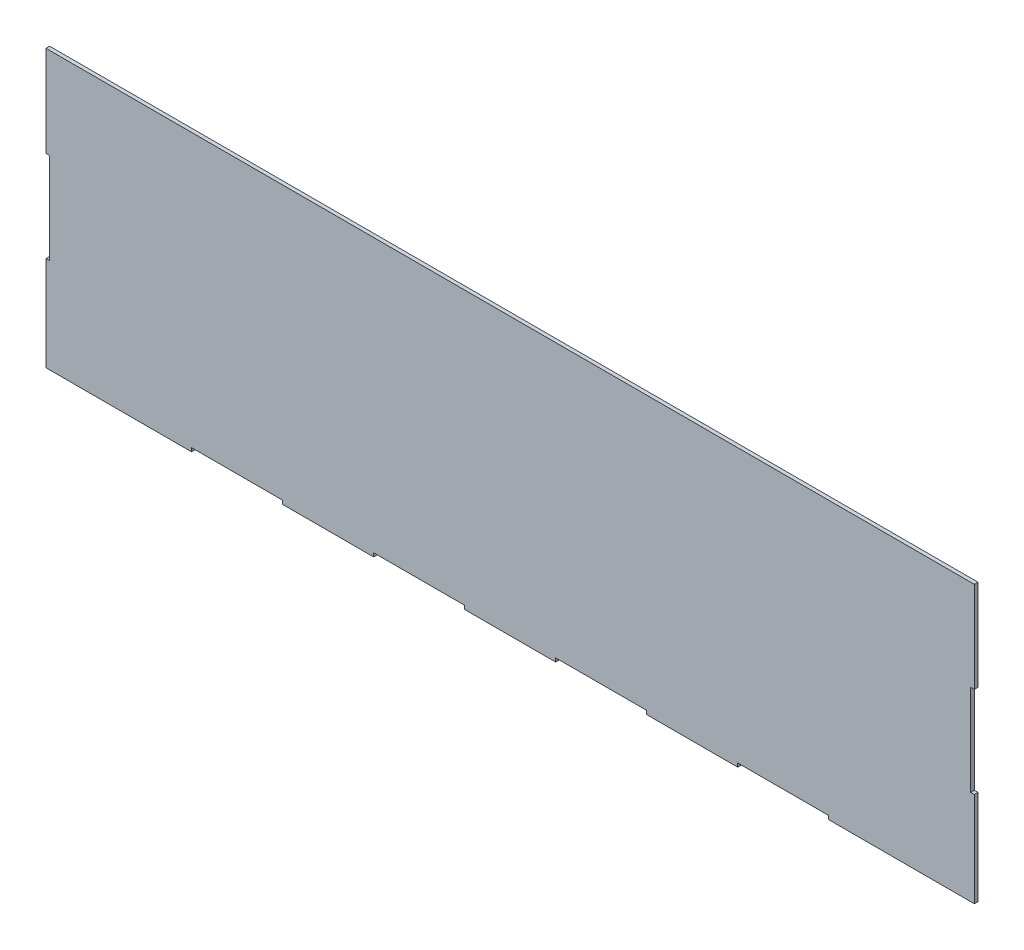
ISO-10303-21;
HEADER;
FILE_DESCRIPTION(('STEP AP214'),'2;1');
FILE_NAME('part.step','',(''),(''),'','','');
FILE_SCHEMA(('AUTOMOTIVE_DESIGN { 1 0 10303 214 1 1 1 1 }'));
ENDSEC;
DATA;
#1=APPLICATION_CONTEXT('core data for automotive mechanical design processes');
#2=APPLICATION_PROTOCOL_DEFINITION('international standard','automotive_design',2000,#1);
#3=PRODUCT_CONTEXT('',#1,'mechanical');
#4=PRODUCT('Part','Part','',(#3));
#5=PRODUCT_RELATED_PRODUCT_CATEGORY('part','',(#4));
#6=PRODUCT_DEFINITION_FORMATION('','',#4);
#7=PRODUCT_DEFINITION_CONTEXT('part definition',#1,'design');
#8=PRODUCT_DEFINITION('design','',#6,#7);
#9=PRODUCT_DEFINITION_SHAPE('','',#8);
#10=(LENGTH_UNIT() NAMED_UNIT(*) SI_UNIT(.MILLI.,.METRE.));
#11=(NAMED_UNIT(*) PLANE_ANGLE_UNIT() SI_UNIT($,.RADIAN.));
#12=(NAMED_UNIT(*) SI_UNIT($,.STERADIAN.) SOLID_ANGLE_UNIT());
#13=UNCERTAINTY_MEASURE_WITH_UNIT(LENGTH_MEASURE(1.E-05),#10,'distance_accuracy_value','');
#14=(GEOMETRIC_REPRESENTATION_CONTEXT(3) GLOBAL_UNCERTAINTY_ASSIGNED_CONTEXT((#13)) GLOBAL_UNIT_ASSIGNED_CONTEXT((#10,
#11,#12)) REPRESENTATION_CONTEXT('',''));
#15=CARTESIAN_POINT('',(0.,0.,0.));
#16=DIRECTION('',(0.,0.,1.));
#17=DIRECTION('',(1.,0.,0.));
#18=AXIS2_PLACEMENT_3D('',#15,#16,#17);
#19=CARTESIAN_POINT('',(878.999456567361,904.966316800808,4.));
#20=DIRECTION('',(1.,0.,0.));
#21=DIRECTION('',(0.,1.,0.));
#22=AXIS2_PLACEMENT_3D('',#19,#20,#21);
#23=PLANE('',#22);
#24=DIRECTION('',(0.,-1.,0.));
#25=VECTOR('',#24,1.);
#26=CARTESIAN_POINT('',(878.999456567361,904.966316800808,0.));
#27=LINE('',#26,#25);
#28=CARTESIAN_POINT('',(878.999456567361,904.966316800808,0.));
#29=VERTEX_POINT('',#28);
#30=CARTESIAN_POINT('',(878.999456567361,804.966316800808,0.));
#31=VERTEX_POINT('',#30);
#32=EDGE_CURVE('E251',#29,#31,#27,.T.);
#33=ORIENTED_EDGE('',*,*,#32,.T.);
#34=DIRECTION('',(0.,0.,-1.));
#35=VECTOR('',#34,1.);
#36=CARTESIAN_POINT('',(878.999456567361,804.966316800808,4.));
#37=LINE('',#36,#35);
#38=CARTESIAN_POINT('',(878.999456567361,804.966316800808,4.));
#39=VERTEX_POINT('',#38);
#40=EDGE_CURVE('E11',#39,#31,#37,.T.);
#41=ORIENTED_EDGE('',*,*,#40,.F.);
#42=DIRECTION('',(0.,-1.,0.));
#43=VECTOR('',#42,1.);
#44=CARTESIAN_POINT('',(878.999456567361,904.966316800808,4.));
#45=LINE('',#44,#43);
#46=CARTESIAN_POINT('',(878.999456567361,904.966316800808,4.));
#47=VERTEX_POINT('',#46);
#48=EDGE_CURVE('E305',#47,#39,#45,.T.);
#49=ORIENTED_EDGE('',*,*,#48,.F.);
#50=DIRECTION('',(0.,0.,-1.));
#51=VECTOR('',#50,1.);
#52=CARTESIAN_POINT('',(878.999456567361,904.966316800808,4.));
#53=LINE('',#52,#51);
#54=EDGE_CURVE('E247',#47,#29,#53,.T.);
#55=ORIENTED_EDGE('',*,*,#54,.T.);
#56=EDGE_LOOP('',(#33,#41,#49,#55));
#57=FACE_BOUND('',#56,.T.);
#58=ADVANCED_FACE('F35',(#57),#23,.F.);
#59=CARTESIAN_POINT('',(878.999456567361,804.966316800808,4.));
#60=DIRECTION('',(0.,-1.,0.));
#61=DIRECTION('',(0.,0.,-1.));
#62=AXIS2_PLACEMENT_3D('',#59,#60,#61);
#63=PLANE('',#62);
#64=DIRECTION('',(-1.,0.,0.));
#65=VECTOR('',#64,1.);
#66=CARTESIAN_POINT('',(878.999456567361,804.966316800808,0.));
#67=LINE('',#66,#65);
#68=CARTESIAN_POINT('',(874.999456567361,804.966316800808,0.));
#69=VERTEX_POINT('',#68);
#70=EDGE_CURVE('E254',#31,#69,#67,.T.);
#71=ORIENTED_EDGE('',*,*,#70,.T.);
#72=DIRECTION('',(0.,0.,-1.));
#73=VECTOR('',#72,1.);
#74=CARTESIAN_POINT('',(874.999456567361,804.966316800808,4.));
#75=LINE('',#74,#73);
#76=CARTESIAN_POINT('',(874.999456567361,804.966316800808,4.));
#77=VERTEX_POINT('',#76);
#78=EDGE_CURVE('E43',#77,#69,#75,.T.);
#79=ORIENTED_EDGE('',*,*,#78,.F.);
#80=DIRECTION('',(-1.,0.,0.));
#81=VECTOR('',#80,1.);
#82=CARTESIAN_POINT('',(878.999456567361,804.966316800808,4.));
#83=LINE('',#82,#81);
#84=EDGE_CURVE('E154',#39,#77,#83,.T.);
#85=ORIENTED_EDGE('',*,*,#84,.F.);
#86=ORIENTED_EDGE('',*,*,#40,.T.);
#87=EDGE_LOOP('',(#71,#79,#85,#86));
#88=FACE_BOUND('',#87,.T.);
#89=ADVANCED_FACE('F463',(#88),#63,.F.);
#90=CARTESIAN_POINT('',(874.999456567361,804.966316800808,4.));
#91=DIRECTION('',(1.,0.,0.));
#92=DIRECTION('',(0.,1.,0.));
#93=AXIS2_PLACEMENT_3D('',#90,#91,#92);
#94=PLANE('',#93);
#95=DIRECTION('',(0.,-1.,0.));
#96=VECTOR('',#95,1.);
#97=CARTESIAN_POINT('',(874.999456567361,804.966316800808,0.));
#98=LINE('',#97,#96);
#99=CARTESIAN_POINT('',(874.999456567361,700.966316800808,0.));
#100=VERTEX_POINT('',#99);
#101=EDGE_CURVE('E256',#69,#100,#98,.T.);
#102=ORIENTED_EDGE('',*,*,#101,.T.);
#103=DIRECTION('',(0.,0.,-1.));
#104=VECTOR('',#103,1.);
#105=CARTESIAN_POINT('',(874.999456567361,700.966316800808,4.));
#106=LINE('',#105,#104);
#107=CARTESIAN_POINT('',(874.999456567361,700.966316800808,4.));
#108=VERTEX_POINT('',#107);
#109=EDGE_CURVE('E372',#108,#100,#106,.T.);
#110=ORIENTED_EDGE('',*,*,#109,.F.);
#111=DIRECTION('',(0.,-1.,0.));
#112=VECTOR('',#111,1.);
#113=CARTESIAN_POINT('',(874.999456567361,804.966316800808,4.));
#114=LINE('',#113,#112);
#115=EDGE_CURVE('E380',#77,#108,#114,.T.);
#116=ORIENTED_EDGE('',*,*,#115,.F.);
#117=ORIENTED_EDGE('',*,*,#78,.T.);
#118=EDGE_LOOP('',(#102,#110,#116,#117));
#119=FACE_BOUND('',#118,.T.);
#120=ADVANCED_FACE('F378',(#119),#94,.F.);
#121=CARTESIAN_POINT('',(874.999456567361,700.966316800808,4.));
#122=DIRECTION('',(0.,1.,0.));
#123=DIRECTION('',(0.,0.,1.));
#124=AXIS2_PLACEMENT_3D('',#121,#122,#123);
#125=PLANE('',#124);
#126=DIRECTION('',(1.,0.,0.));
#127=VECTOR('',#126,1.);
#128=CARTESIAN_POINT('',(874.999456567361,700.966316800808,0.));
#129=LINE('',#128,#127);
#130=CARTESIAN_POINT('',(1034.99945656736,700.966316800808,0.));
#131=VERTEX_POINT('',#130);
#132=EDGE_CURVE('E258',#100,#131,#129,.T.);
#133=ORIENTED_EDGE('',*,*,#132,.T.);
#134=DIRECTION('',(0.,0.,-1.));
#135=VECTOR('',#134,1.);
#136=CARTESIAN_POINT('',(1034.99945656736,700.966316800808,4.));
#137=LINE('',#136,#135);
#138=CARTESIAN_POINT('',(1034.99945656736,700.966316800808,4.));
#139=VERTEX_POINT('',#138);
#140=EDGE_CURVE('E369',#139,#131,#137,.T.);
#141=ORIENTED_EDGE('',*,*,#140,.F.);
#142=DIRECTION('',(1.,0.,0.));
#143=VECTOR('',#142,1.);
#144=CARTESIAN_POINT('',(874.999456567361,700.966316800808,4.));
#145=LINE('',#144,#143);
#146=EDGE_CURVE('E398',#108,#139,#145,.T.);
#147=ORIENTED_EDGE('',*,*,#146,.F.);
#148=ORIENTED_EDGE('',*,*,#109,.T.);
#149=EDGE_LOOP('',(#133,#141,#147,#148));
#150=FACE_BOUND('',#149,.T.);
#151=ADVANCED_FACE('F389',(#150),#125,.F.);
#152=CARTESIAN_POINT('',(1034.99945656736,700.966316800808,4.));
#153=DIRECTION('',(-1.,0.,0.));
#154=DIRECTION('',(0.,0.,1.));
#155=AXIS2_PLACEMENT_3D('',#152,#153,#154);
#156=PLANE('',#155);
#157=DIRECTION('',(0.,1.,0.));
#158=VECTOR('',#157,1.);
#159=CARTESIAN_POINT('',(1034.99945656736,700.966316800808,0.));
#160=LINE('',#159,#158);
#161=CARTESIAN_POINT('',(1034.99945656736,704.966316800808,0.));
#162=VERTEX_POINT('',#161);
#163=EDGE_CURVE('E260',#131,#162,#160,.T.);
#164=ORIENTED_EDGE('',*,*,#163,.T.);
#165=DIRECTION('',(0.,0.,-1.));
#166=VECTOR('',#165,1.);
#167=CARTESIAN_POINT('',(1034.99945656736,704.966316800808,4.));
#168=LINE('',#167,#166);
#169=CARTESIAN_POINT('',(1034.99945656736,704.966316800808,4.));
#170=VERTEX_POINT('',#169);
#171=EDGE_CURVE('E366',#170,#162,#168,.T.);
#172=ORIENTED_EDGE('',*,*,#171,.F.);
#173=DIRECTION('',(0.,1.,0.));
#174=VECTOR('',#173,1.);
#175=CARTESIAN_POINT('',(1034.99945656736,700.966316800808,4.));
#176=LINE('',#175,#174);
#177=EDGE_CURVE('E395',#139,#170,#176,.T.);
#178=ORIENTED_EDGE('',*,*,#177,.F.);
#179=ORIENTED_EDGE('',*,*,#140,.T.);
#180=EDGE_LOOP('',(#164,#172,#178,#179));
#181=FACE_BOUND('',#180,.T.);
#182=ADVANCED_FACE('F393',(#181),#156,.F.);
#183=CARTESIAN_POINT('',(1034.99945656736,704.966316800808,4.));
#184=DIRECTION('',(0.,1.,0.));
#185=DIRECTION('',(0.,0.,1.));
#186=AXIS2_PLACEMENT_3D('',#183,#184,#185);
#187=PLANE('',#186);
#188=DIRECTION('',(1.,0.,0.));
#189=VECTOR('',#188,1.);
#190=CARTESIAN_POINT('',(1034.99945656736,704.966316800808,0.));
#191=LINE('',#190,#189);
#192=CARTESIAN_POINT('',(1134.99945656736,704.966316800808,0.));
#193=VERTEX_POINT('',#192);
#194=EDGE_CURVE('E262',#162,#193,#191,.T.);
#195=ORIENTED_EDGE('',*,*,#194,.T.);
#196=DIRECTION('',(0.,0.,-1.));
#197=VECTOR('',#196,1.);
#198=CARTESIAN_POINT('',(1134.99945656736,704.966316800808,4.));
#199=LINE('',#198,#197);
#200=CARTESIAN_POINT('',(1134.99945656736,704.966316800808,4.));
#201=VERTEX_POINT('',#200);
#202=EDGE_CURVE('E363',#201,#193,#199,.T.);
#203=ORIENTED_EDGE('',*,*,#202,.F.);
#204=DIRECTION('',(1.,0.,0.));
#205=VECTOR('',#204,1.);
#206=CARTESIAN_POINT('',(1034.99945656736,704.966316800808,4.));
#207=LINE('',#206,#205);
#208=EDGE_CURVE('E397',#170,#201,#207,.T.);
#209=ORIENTED_EDGE('',*,*,#208,.F.);
#210=ORIENTED_EDGE('',*,*,#171,.T.);
#211=EDGE_LOOP('',(#195,#203,#209,#210));
#212=FACE_BOUND('',#211,.T.);
#213=ADVANCED_FACE('F476',(#212),#187,.F.);
#214=CARTESIAN_POINT('',(1134.99945656736,704.966316800808,4.));
#215=DIRECTION('',(1.,0.,0.));
#216=DIRECTION('',(0.,0.,-1.));
#217=AXIS2_PLACEMENT_3D('',#214,#215,#216);
#218=PLANE('',#217);
#219=DIRECTION('',(0.,-1.,0.));
#220=VECTOR('',#219,1.);
#221=CARTESIAN_POINT('',(1134.99945656736,704.966316800808,0.));
#222=LINE('',#221,#220);
#223=CARTESIAN_POINT('',(1134.99945656736,700.966316800808,0.));
#224=VERTEX_POINT('',#223);
#225=EDGE_CURVE('E264',#193,#224,#222,.T.);
#226=ORIENTED_EDGE('',*,*,#225,.T.);
#227=DIRECTION('',(0.,0.,-1.));
#228=VECTOR('',#227,1.);
#229=CARTESIAN_POINT('',(1134.99945656736,700.966316800808,4.));
#230=LINE('',#229,#228);
#231=CARTESIAN_POINT('',(1134.99945656736,700.966316800808,4.));
#232=VERTEX_POINT('',#231);
#233=EDGE_CURVE('E360',#232,#224,#230,.T.);
#234=ORIENTED_EDGE('',*,*,#233,.F.);
#235=DIRECTION('',(0.,-1.,0.));
#236=VECTOR('',#235,1.);
#237=CARTESIAN_POINT('',(1134.99945656736,704.966316800808,4.));
#238=LINE('',#237,#236);
#239=EDGE_CURVE('E400',#201,#232,#238,.T.);
#240=ORIENTED_EDGE('',*,*,#239,.F.);
#241=ORIENTED_EDGE('',*,*,#202,.T.);
#242=EDGE_LOOP('',(#226,#234,#240,#241));
#243=FACE_BOUND('',#242,.T.);
#244=ADVANCED_FACE('F479',(#243),#218,.F.);
#245=CARTESIAN_POINT('',(1134.99945656736,700.966316800808,4.));
#246=DIRECTION('',(0.,1.,0.));
#247=DIRECTION('',(0.,0.,1.));
#248=AXIS2_PLACEMENT_3D('',#245,#246,#247);
#249=PLANE('',#248);
#250=DIRECTION('',(1.,0.,0.));
#251=VECTOR('',#250,1.);
#252=CARTESIAN_POINT('',(1134.99945656736,700.966316800808,0.));
#253=LINE('',#252,#251);
#254=CARTESIAN_POINT('',(1234.99945656736,700.966316800808,0.));
#255=VERTEX_POINT('',#254);
#256=EDGE_CURVE('E266',#224,#255,#253,.T.);
#257=ORIENTED_EDGE('',*,*,#256,.T.);
#258=DIRECTION('',(0.,0.,-1.));
#259=VECTOR('',#258,1.);
#260=CARTESIAN_POINT('',(1234.99945656736,700.966316800808,4.));
#261=LINE('',#260,#259);
#262=CARTESIAN_POINT('',(1234.99945656736,700.966316800808,4.));
#263=VERTEX_POINT('',#262);
#264=EDGE_CURVE('E357',#263,#255,#261,.T.);
#265=ORIENTED_EDGE('',*,*,#264,.F.);
#266=DIRECTION('',(1.,0.,0.));
#267=VECTOR('',#266,1.);
#268=CARTESIAN_POINT('',(1134.99945656736,700.966316800808,4.));
#269=LINE('',#268,#267);
#270=EDGE_CURVE('E406',#232,#263,#269,.T.);
#271=ORIENTED_EDGE('',*,*,#270,.F.);
#272=ORIENTED_EDGE('',*,*,#233,.T.);
#273=EDGE_LOOP('',(#257,#265,#271,#272));
#274=FACE_BOUND('',#273,.T.);
#275=ADVANCED_FACE('F483',(#274),#249,.F.);
#276=CARTESIAN_POINT('',(1234.99945656736,700.966316800808,4.));
#277=DIRECTION('',(-1.,0.,0.));
#278=DIRECTION('',(0.,0.,1.));
#279=AXIS2_PLACEMENT_3D('',#276,#277,#278);
#280=PLANE('',#279);
#281=DIRECTION('',(0.,1.,0.));
#282=VECTOR('',#281,1.);
#283=CARTESIAN_POINT('',(1234.99945656736,700.966316800808,0.));
#284=LINE('',#283,#282);
#285=CARTESIAN_POINT('',(1234.99945656736,704.966316800808,0.));
#286=VERTEX_POINT('',#285);
#287=EDGE_CURVE('E268',#255,#286,#284,.T.);
#288=ORIENTED_EDGE('',*,*,#287,.T.);
#289=DIRECTION('',(0.,0.,-1.));
#290=VECTOR('',#289,1.);
#291=CARTESIAN_POINT('',(1234.99945656736,704.966316800808,4.));
#292=LINE('',#291,#290);
#293=CARTESIAN_POINT('',(1234.99945656736,704.966316800808,4.));
#294=VERTEX_POINT('',#293);
#295=EDGE_CURVE('E354',#294,#286,#292,.T.);
#296=ORIENTED_EDGE('',*,*,#295,.F.);
#297=DIRECTION('',(0.,1.,0.));
#298=VECTOR('',#297,1.);
#299=CARTESIAN_POINT('',(1234.99945656736,700.966316800808,4.));
#300=LINE('',#299,#298);
#301=EDGE_CURVE('E408',#263,#294,#300,.T.);
#302=ORIENTED_EDGE('',*,*,#301,.F.);
#303=ORIENTED_EDGE('',*,*,#264,.T.);
#304=EDGE_LOOP('',(#288,#296,#302,#303));
#305=FACE_BOUND('',#304,.T.);
#306=ADVANCED_FACE('F487',(#305),#280,.F.);
#307=CARTESIAN_POINT('',(1234.99945656736,704.966316800808,4.));
#308=DIRECTION('',(0.,1.,0.));
#309=DIRECTION('',(0.,0.,1.));
#310=AXIS2_PLACEMENT_3D('',#307,#308,#309);
#311=PLANE('',#310);
#312=DIRECTION('',(1.,0.,0.));
#313=VECTOR('',#312,1.);
#314=CARTESIAN_POINT('',(1234.99945656736,704.966316800808,0.));
#315=LINE('',#314,#313);
#316=CARTESIAN_POINT('',(1334.99945656736,704.966316800808,0.));
#317=VERTEX_POINT('',#316);
#318=EDGE_CURVE('E270',#286,#317,#315,.T.);
#319=ORIENTED_EDGE('',*,*,#318,.T.);
#320=DIRECTION('',(0.,0.,-1.));
#321=VECTOR('',#320,1.);
#322=CARTESIAN_POINT('',(1334.99945656736,704.966316800808,4.));
#323=LINE('',#322,#321);
#324=CARTESIAN_POINT('',(1334.99945656736,704.966316800808,4.));
#325=VERTEX_POINT('',#324);
#326=EDGE_CURVE('E351',#325,#317,#323,.T.);
#327=ORIENTED_EDGE('',*,*,#326,.F.);
#328=DIRECTION('',(1.,0.,0.));
#329=VECTOR('',#328,1.);
#330=CARTESIAN_POINT('',(1234.99945656736,704.966316800808,4.));
#331=LINE('',#330,#329);
#332=EDGE_CURVE('E410',#294,#325,#331,.T.);
#333=ORIENTED_EDGE('',*,*,#332,.F.);
#334=ORIENTED_EDGE('',*,*,#295,.T.);
#335=EDGE_LOOP('',(#319,#327,#333,#334));
#336=FACE_BOUND('',#335,.T.);
#337=ADVANCED_FACE('F491',(#336),#311,.F.);
#338=CARTESIAN_POINT('',(1334.99945656736,704.966316800808,4.));
#339=DIRECTION('',(1.,0.,0.));
#340=DIRECTION('',(0.,0.,-1.));
#341=AXIS2_PLACEMENT_3D('',#338,#339,#340);
#342=PLANE('',#341);
#343=DIRECTION('',(0.,-1.,0.));
#344=VECTOR('',#343,1.);
#345=CARTESIAN_POINT('',(1334.99945656736,704.966316800808,0.));
#346=LINE('',#345,#344);
#347=CARTESIAN_POINT('',(1334.99945656736,700.966316800808,0.));
#348=VERTEX_POINT('',#347);
#349=EDGE_CURVE('E272',#317,#348,#346,.T.);
#350=ORIENTED_EDGE('',*,*,#349,.T.);
#351=DIRECTION('',(0.,0.,-1.));
#352=VECTOR('',#351,1.);
#353=CARTESIAN_POINT('',(1334.99945656736,700.966316800808,4.));
#354=LINE('',#353,#352);
#355=CARTESIAN_POINT('',(1334.99945656736,700.966316800808,4.));
#356=VERTEX_POINT('',#355);
#357=EDGE_CURVE('E348',#356,#348,#354,.T.);
#358=ORIENTED_EDGE('',*,*,#357,.F.);
#359=DIRECTION('',(0.,-1.,0.));
#360=VECTOR('',#359,1.);
#361=CARTESIAN_POINT('',(1334.99945656736,704.966316800808,4.));
#362=LINE('',#361,#360);
#363=EDGE_CURVE('E412',#325,#356,#362,.T.);
#364=ORIENTED_EDGE('',*,*,#363,.F.);
#365=ORIENTED_EDGE('',*,*,#326,.T.);
#366=EDGE_LOOP('',(#350,#358,#364,#365));
#367=FACE_BOUND('',#366,.T.);
#368=ADVANCED_FACE('F495',(#367),#342,.F.);
#369=CARTESIAN_POINT('',(1334.99945656736,700.966316800808,4.));
#370=DIRECTION('',(0.,1.,0.));
#371=DIRECTION('',(0.,0.,1.));
#372=AXIS2_PLACEMENT_3D('',#369,#370,#371);
#373=PLANE('',#372);
#374=DIRECTION('',(1.,0.,0.));
#375=VECTOR('',#374,1.);
#376=CARTESIAN_POINT('',(1334.99945656736,700.966316800808,0.));
#377=LINE('',#376,#375);
#378=CARTESIAN_POINT('',(1434.99945656736,700.966316800808,0.));
#379=VERTEX_POINT('',#378);
#380=EDGE_CURVE('E274',#348,#379,#377,.T.);
#381=ORIENTED_EDGE('',*,*,#380,.T.);
#382=DIRECTION('',(0.,0.,-1.));
#383=VECTOR('',#382,1.);
#384=CARTESIAN_POINT('',(1434.99945656736,700.966316800808,4.));
#385=LINE('',#384,#383);
#386=CARTESIAN_POINT('',(1434.99945656736,700.966316800808,4.));
#387=VERTEX_POINT('',#386);
#388=EDGE_CURVE('E345',#387,#379,#385,.T.);
#389=ORIENTED_EDGE('',*,*,#388,.F.);
#390=DIRECTION('',(1.,0.,0.));
#391=VECTOR('',#390,1.);
#392=CARTESIAN_POINT('',(1334.99945656736,700.966316800808,4.));
#393=LINE('',#392,#391);
#394=EDGE_CURVE('E414',#356,#387,#393,.T.);
#395=ORIENTED_EDGE('',*,*,#394,.F.);
#396=ORIENTED_EDGE('',*,*,#357,.T.);
#397=EDGE_LOOP('',(#381,#389,#395,#396));
#398=FACE_BOUND('',#397,.T.);
#399=ADVANCED_FACE('F499',(#398),#373,.F.);
#400=CARTESIAN_POINT('',(1434.99945656736,700.966316800808,4.));
#401=DIRECTION('',(-1.,0.,0.));
#402=DIRECTION('',(0.,0.,1.));
#403=AXIS2_PLACEMENT_3D('',#400,#401,#402);
#404=PLANE('',#403);
#405=DIRECTION('',(0.,1.,0.));
#406=VECTOR('',#405,1.);
#407=CARTESIAN_POINT('',(1434.99945656736,700.966316800808,0.));
#408=LINE('',#407,#406);
#409=CARTESIAN_POINT('',(1434.99945656736,704.966316800808,0.));
#410=VERTEX_POINT('',#409);
#411=EDGE_CURVE('E276',#379,#410,#408,.T.);
#412=ORIENTED_EDGE('',*,*,#411,.T.);
#413=DIRECTION('',(0.,0.,-1.));
#414=VECTOR('',#413,1.);
#415=CARTESIAN_POINT('',(1434.99945656736,704.966316800808,4.));
#416=LINE('',#415,#414);
#417=CARTESIAN_POINT('',(1434.99945656736,704.966316800808,4.));
#418=VERTEX_POINT('',#417);
#419=EDGE_CURVE('E342',#418,#410,#416,.T.);
#420=ORIENTED_EDGE('',*,*,#419,.F.);
#421=DIRECTION('',(0.,1.,0.));
#422=VECTOR('',#421,1.);
#423=CARTESIAN_POINT('',(1434.99945656736,700.966316800808,4.));
#424=LINE('',#423,#422);
#425=EDGE_CURVE('E416',#387,#418,#424,.T.);
#426=ORIENTED_EDGE('',*,*,#425,.F.);
#427=ORIENTED_EDGE('',*,*,#388,.T.);
#428=EDGE_LOOP('',(#412,#420,#426,#427));
#429=FACE_BOUND('',#428,.T.);
#430=ADVANCED_FACE('F503',(#429),#404,.F.);
#431=CARTESIAN_POINT('',(1434.99945656736,704.966316800808,4.));
#432=DIRECTION('',(0.,1.,0.));
#433=DIRECTION('',(0.,0.,1.));
#434=AXIS2_PLACEMENT_3D('',#431,#432,#433);
#435=PLANE('',#434);
#436=DIRECTION('',(1.,0.,0.));
#437=VECTOR('',#436,1.);
#438=CARTESIAN_POINT('',(1434.99945656736,704.966316800808,0.));
#439=LINE('',#438,#437);
#440=CARTESIAN_POINT('',(1534.99945656736,704.966316800808,0.));
#441=VERTEX_POINT('',#440);
#442=EDGE_CURVE('E278',#410,#441,#439,.T.);
#443=ORIENTED_EDGE('',*,*,#442,.T.);
#444=DIRECTION('',(0.,0.,-1.));
#445=VECTOR('',#444,1.);
#446=CARTESIAN_POINT('',(1534.99945656736,704.966316800808,4.));
#447=LINE('',#446,#445);
#448=CARTESIAN_POINT('',(1534.99945656736,704.966316800808,4.));
#449=VERTEX_POINT('',#448);
#450=EDGE_CURVE('E339',#449,#441,#447,.T.);
#451=ORIENTED_EDGE('',*,*,#450,.F.);
#452=DIRECTION('',(1.,0.,0.));
#453=VECTOR('',#452,1.);
#454=CARTESIAN_POINT('',(1434.99945656736,704.966316800808,4.));
#455=LINE('',#454,#453);
#456=EDGE_CURVE('E418',#418,#449,#455,.T.);
#457=ORIENTED_EDGE('',*,*,#456,.F.);
#458=ORIENTED_EDGE('',*,*,#419,.T.);
#459=EDGE_LOOP('',(#443,#451,#457,#458));
#460=FACE_BOUND('',#459,.T.);
#461=ADVANCED_FACE('F507',(#460),#435,.F.);
#462=CARTESIAN_POINT('',(1534.99945656736,704.966316800808,4.));
#463=DIRECTION('',(1.,0.,0.));
#464=DIRECTION('',(0.,0.,-1.));
#465=AXIS2_PLACEMENT_3D('',#462,#463,#464);
#466=PLANE('',#465);
#467=DIRECTION('',(0.,-1.,0.));
#468=VECTOR('',#467,1.);
#469=CARTESIAN_POINT('',(1534.99945656736,704.966316800808,0.));
#470=LINE('',#469,#468);
#471=CARTESIAN_POINT('',(1534.99945656736,700.966316800808,0.));
#472=VERTEX_POINT('',#471);
#473=EDGE_CURVE('E280',#441,#472,#470,.T.);
#474=ORIENTED_EDGE('',*,*,#473,.T.);
#475=DIRECTION('',(0.,0.,-1.));
#476=VECTOR('',#475,1.);
#477=CARTESIAN_POINT('',(1534.99945656736,700.966316800808,4.));
#478=LINE('',#477,#476);
#479=CARTESIAN_POINT('',(1534.99945656736,700.966316800808,4.));
#480=VERTEX_POINT('',#479);
#481=EDGE_CURVE('E336',#480,#472,#478,.T.);
#482=ORIENTED_EDGE('',*,*,#481,.F.);
#483=DIRECTION('',(0.,-1.,0.));
#484=VECTOR('',#483,1.);
#485=CARTESIAN_POINT('',(1534.99945656736,704.966316800808,4.));
#486=LINE('',#485,#484);
#487=EDGE_CURVE('E420',#449,#480,#486,.T.);
#488=ORIENTED_EDGE('',*,*,#487,.F.);
#489=ORIENTED_EDGE('',*,*,#450,.T.);
#490=EDGE_LOOP('',(#474,#482,#488,#489));
#491=FACE_BOUND('',#490,.T.);
#492=ADVANCED_FACE('F511',(#491),#466,.F.);
#493=CARTESIAN_POINT('',(1534.99945656736,700.966316800808,4.));
#494=DIRECTION('',(0.,1.,0.));
#495=DIRECTION('',(0.,0.,1.));
#496=AXIS2_PLACEMENT_3D('',#493,#494,#495);
#497=PLANE('',#496);
#498=DIRECTION('',(1.,0.,0.));
#499=VECTOR('',#498,1.);
#500=CARTESIAN_POINT('',(1534.99945656736,700.966316800808,0.));
#501=LINE('',#500,#499);
#502=CARTESIAN_POINT('',(1634.99945656736,700.966316800808,0.));
#503=VERTEX_POINT('',#502);
#504=EDGE_CURVE('E282',#472,#503,#501,.T.);
#505=ORIENTED_EDGE('',*,*,#504,.T.);
#506=DIRECTION('',(0.,0.,-1.));
#507=VECTOR('',#506,1.);
#508=CARTESIAN_POINT('',(1634.99945656736,700.966316800808,4.));
#509=LINE('',#508,#507);
#510=CARTESIAN_POINT('',(1634.99945656736,700.966316800808,4.));
#511=VERTEX_POINT('',#510);
#512=EDGE_CURVE('E333',#511,#503,#509,.T.);
#513=ORIENTED_EDGE('',*,*,#512,.F.);
#514=DIRECTION('',(1.,0.,0.));
#515=VECTOR('',#514,1.);
#516=CARTESIAN_POINT('',(1534.99945656736,700.966316800808,4.));
#517=LINE('',#516,#515);
#518=EDGE_CURVE('E422',#480,#511,#517,.T.);
#519=ORIENTED_EDGE('',*,*,#518,.F.);
#520=ORIENTED_EDGE('',*,*,#481,.T.);
#521=EDGE_LOOP('',(#505,#513,#519,#520));
#522=FACE_BOUND('',#521,.T.);
#523=ADVANCED_FACE('F515',(#522),#497,.F.);
#524=CARTESIAN_POINT('',(1634.99945656736,700.966316800808,4.));
#525=DIRECTION('',(-1.,0.,0.));
#526=DIRECTION('',(0.,0.,1.));
#527=AXIS2_PLACEMENT_3D('',#524,#525,#526);
#528=PLANE('',#527);
#529=DIRECTION('',(0.,1.,0.));
#530=VECTOR('',#529,1.);
#531=CARTESIAN_POINT('',(1634.99945656736,700.966316800808,0.));
#532=LINE('',#531,#530);
#533=CARTESIAN_POINT('',(1634.99945656736,704.966316800808,0.));
#534=VERTEX_POINT('',#533);
#535=EDGE_CURVE('E284',#503,#534,#532,.T.);
#536=ORIENTED_EDGE('',*,*,#535,.T.);
#537=DIRECTION('',(0.,0.,-1.));
#538=VECTOR('',#537,1.);
#539=CARTESIAN_POINT('',(1634.99945656736,704.966316800808,4.));
#540=LINE('',#539,#538);
#541=CARTESIAN_POINT('',(1634.99945656736,704.966316800808,4.));
#542=VERTEX_POINT('',#541);
#543=EDGE_CURVE('E330',#542,#534,#540,.T.);
#544=ORIENTED_EDGE('',*,*,#543,.F.);
#545=DIRECTION('',(0.,1.,0.));
#546=VECTOR('',#545,1.);
#547=CARTESIAN_POINT('',(1634.99945656736,700.966316800808,4.));
#548=LINE('',#547,#546);
#549=EDGE_CURVE('E424',#511,#542,#548,.T.);
#550=ORIENTED_EDGE('',*,*,#549,.F.);
#551=ORIENTED_EDGE('',*,*,#512,.T.);
#552=EDGE_LOOP('',(#536,#544,#550,#551));
#553=FACE_BOUND('',#552,.T.);
#554=ADVANCED_FACE('F519',(#553),#528,.F.);
#555=CARTESIAN_POINT('',(1634.99945656736,704.966316800808,4.));
#556=DIRECTION('',(0.,1.,0.));
#557=DIRECTION('',(0.,0.,1.));
#558=AXIS2_PLACEMENT_3D('',#555,#556,#557);
#559=PLANE('',#558);
#560=DIRECTION('',(1.,0.,0.));
#561=VECTOR('',#560,1.);
#562=CARTESIAN_POINT('',(1634.99945656736,704.966316800808,0.));
#563=LINE('',#562,#561);
#564=CARTESIAN_POINT('',(1734.99945656736,704.966316800808,0.));
#565=VERTEX_POINT('',#564);
#566=EDGE_CURVE('E286',#534,#565,#563,.T.);
#567=ORIENTED_EDGE('',*,*,#566,.T.);
#568=DIRECTION('',(0.,0.,-1.));
#569=VECTOR('',#568,1.);
#570=CARTESIAN_POINT('',(1734.99945656736,704.966316800808,4.));
#571=LINE('',#570,#569);
#572=CARTESIAN_POINT('',(1734.99945656736,704.966316800808,4.));
#573=VERTEX_POINT('',#572);
#574=EDGE_CURVE('E327',#573,#565,#571,.T.);
#575=ORIENTED_EDGE('',*,*,#574,.F.);
#576=DIRECTION('',(1.,0.,0.));
#577=VECTOR('',#576,1.);
#578=CARTESIAN_POINT('',(1634.99945656736,704.966316800808,4.));
#579=LINE('',#578,#577);
#580=EDGE_CURVE('E426',#542,#573,#579,.T.);
#581=ORIENTED_EDGE('',*,*,#580,.F.);
#582=ORIENTED_EDGE('',*,*,#543,.T.);
#583=EDGE_LOOP('',(#567,#575,#581,#582));
#584=FACE_BOUND('',#583,.T.);
#585=ADVANCED_FACE('F523',(#584),#559,.F.);
#586=CARTESIAN_POINT('',(1734.99945656736,704.966316800808,4.));
#587=DIRECTION('',(1.,0.,0.));
#588=DIRECTION('',(0.,0.,-1.));
#589=AXIS2_PLACEMENT_3D('',#586,#587,#588);
#590=PLANE('',#589);
#591=DIRECTION('',(0.,-1.,0.));
#592=VECTOR('',#591,1.);
#593=CARTESIAN_POINT('',(1734.99945656736,704.966316800808,0.));
#594=LINE('',#593,#592);
#595=CARTESIAN_POINT('',(1734.99945656736,700.966316800808,0.));
#596=VERTEX_POINT('',#595);
#597=EDGE_CURVE('E288',#565,#596,#594,.T.);
#598=ORIENTED_EDGE('',*,*,#597,.T.);
#599=DIRECTION('',(0.,0.,-1.));
#600=VECTOR('',#599,1.);
#601=CARTESIAN_POINT('',(1734.99945656736,700.966316800808,4.));
#602=LINE('',#601,#600);
#603=CARTESIAN_POINT('',(1734.99945656736,700.966316800808,4.));
#604=VERTEX_POINT('',#603);
#605=EDGE_CURVE('E324',#604,#596,#602,.T.);
#606=ORIENTED_EDGE('',*,*,#605,.F.);
#607=DIRECTION('',(0.,-1.,0.));
#608=VECTOR('',#607,1.);
#609=CARTESIAN_POINT('',(1734.99945656736,704.966316800808,4.));
#610=LINE('',#609,#608);
#611=EDGE_CURVE('E428',#573,#604,#610,.T.);
#612=ORIENTED_EDGE('',*,*,#611,.F.);
#613=ORIENTED_EDGE('',*,*,#574,.T.);
#614=EDGE_LOOP('',(#598,#606,#612,#613));
#615=FACE_BOUND('',#614,.T.);
#616=ADVANCED_FACE('F527',(#615),#590,.F.);
#617=CARTESIAN_POINT('',(1734.99945656736,700.966316800808,4.));
#618=DIRECTION('',(0.,1.,0.));
#619=DIRECTION('',(0.,0.,1.));
#620=AXIS2_PLACEMENT_3D('',#617,#618,#619);
#621=PLANE('',#620);
#622=DIRECTION('',(1.,0.,0.));
#623=VECTOR('',#622,1.);
#624=CARTESIAN_POINT('',(1734.99945656736,700.966316800808,0.));
#625=LINE('',#624,#623);
#626=CARTESIAN_POINT('',(1894.99945656736,700.966316800808,0.));
#627=VERTEX_POINT('',#626);
#628=EDGE_CURVE('E290',#596,#627,#625,.T.);
#629=ORIENTED_EDGE('',*,*,#628,.T.);
#630=DIRECTION('',(0.,0.,-1.));
#631=VECTOR('',#630,1.);
#632=CARTESIAN_POINT('',(1894.99945656736,700.966316800808,4.));
#633=LINE('',#632,#631);
#634=CARTESIAN_POINT('',(1894.99945656736,700.966316800808,4.));
#635=VERTEX_POINT('',#634);
#636=EDGE_CURVE('E321',#635,#627,#633,.T.);
#637=ORIENTED_EDGE('',*,*,#636,.F.);
#638=DIRECTION('',(1.,0.,0.));
#639=VECTOR('',#638,1.);
#640=CARTESIAN_POINT('',(1734.99945656736,700.966316800808,4.));
#641=LINE('',#640,#639);
#642=EDGE_CURVE('E430',#604,#635,#641,.T.);
#643=ORIENTED_EDGE('',*,*,#642,.F.);
#644=ORIENTED_EDGE('',*,*,#605,.T.);
#645=EDGE_LOOP('',(#629,#637,#643,#644));
#646=FACE_BOUND('',#645,.T.);
#647=ADVANCED_FACE('F531',(#646),#621,.F.);
#648=CARTESIAN_POINT('',(1894.99945656736,700.966316800808,4.));
#649=DIRECTION('',(-1.,0.,0.));
#650=DIRECTION('',(0.,-1.,0.));
#651=AXIS2_PLACEMENT_3D('',#648,#649,#650);
#652=PLANE('',#651);
#653=DIRECTION('',(0.,1.,0.));
#654=VECTOR('',#653,1.);
#655=CARTESIAN_POINT('',(1894.99945656736,700.966316800808,0.));
#656=LINE('',#655,#654);
#657=CARTESIAN_POINT('',(1894.99945656736,804.966316800808,0.));
#658=VERTEX_POINT('',#657);
#659=EDGE_CURVE('E292',#627,#658,#656,.T.);
#660=ORIENTED_EDGE('',*,*,#659,.T.);
#661=DIRECTION('',(0.,0.,-1.));
#662=VECTOR('',#661,1.);
#663=CARTESIAN_POINT('',(1894.99945656736,804.966316800808,4.));
#664=LINE('',#663,#662);
#665=CARTESIAN_POINT('',(1894.99945656736,804.966316800808,4.));
#666=VERTEX_POINT('',#665);
#667=EDGE_CURVE('E318',#666,#658,#664,.T.);
#668=ORIENTED_EDGE('',*,*,#667,.F.);
#669=DIRECTION('',(0.,1.,0.));
#670=VECTOR('',#669,1.);
#671=CARTESIAN_POINT('',(1894.99945656736,700.966316800808,4.));
#672=LINE('',#671,#670);
#673=EDGE_CURVE('E432',#635,#666,#672,.T.);
#674=ORIENTED_EDGE('',*,*,#673,.F.);
#675=ORIENTED_EDGE('',*,*,#636,.T.);
#676=EDGE_LOOP('',(#660,#668,#674,#675));
#677=FACE_BOUND('',#676,.T.);
#678=ADVANCED_FACE('F535',(#677),#652,.F.);
#679=CARTESIAN_POINT('',(1894.99945656736,804.966316800808,4.));
#680=DIRECTION('',(0.,-1.,0.));
#681=DIRECTION('',(0.,0.,-1.));
#682=AXIS2_PLACEMENT_3D('',#679,#680,#681);
#683=PLANE('',#682);
#684=DIRECTION('',(-1.,0.,0.));
#685=VECTOR('',#684,1.);
#686=CARTESIAN_POINT('',(1894.99945656736,804.966316800808,0.));
#687=LINE('',#686,#685);
#688=CARTESIAN_POINT('',(1890.99945656736,804.966316800808,0.));
#689=VERTEX_POINT('',#688);
#690=EDGE_CURVE('E294',#658,#689,#687,.T.);
#691=ORIENTED_EDGE('',*,*,#690,.T.);
#692=DIRECTION('',(0.,0.,-1.));
#693=VECTOR('',#692,1.);
#694=CARTESIAN_POINT('',(1890.99945656736,804.966316800808,4.));
#695=LINE('',#694,#693);
#696=CARTESIAN_POINT('',(1890.99945656736,804.966316800808,4.));
#697=VERTEX_POINT('',#696);
#698=EDGE_CURVE('E315',#697,#689,#695,.T.);
#699=ORIENTED_EDGE('',*,*,#698,.F.);
#700=DIRECTION('',(-1.,0.,0.));
#701=VECTOR('',#700,1.);
#702=CARTESIAN_POINT('',(1894.99945656736,804.966316800808,4.));
#703=LINE('',#702,#701);
#704=EDGE_CURVE('E434',#666,#697,#703,.T.);
#705=ORIENTED_EDGE('',*,*,#704,.F.);
#706=ORIENTED_EDGE('',*,*,#667,.T.);
#707=EDGE_LOOP('',(#691,#699,#705,#706));
#708=FACE_BOUND('',#707,.T.);
#709=ADVANCED_FACE('F539',(#708),#683,.F.);
#710=CARTESIAN_POINT('',(1890.99945656736,804.966316800808,4.));
#711=DIRECTION('',(-1.,0.,0.));
#712=DIRECTION('',(0.,-1.,0.));
#713=AXIS2_PLACEMENT_3D('',#710,#711,#712);
#714=PLANE('',#713);
#715=DIRECTION('',(0.,1.,0.));
#716=VECTOR('',#715,1.);
#717=CARTESIAN_POINT('',(1890.99945656736,804.966316800808,0.));
#718=LINE('',#717,#716);
#719=CARTESIAN_POINT('',(1890.99945656736,904.966316800808,0.));
#720=VERTEX_POINT('',#719);
#721=EDGE_CURVE('E296',#689,#720,#718,.T.);
#722=ORIENTED_EDGE('',*,*,#721,.T.);
#723=DIRECTION('',(0.,0.,-1.));
#724=VECTOR('',#723,1.);
#725=CARTESIAN_POINT('',(1890.99945656736,904.966316800808,4.));
#726=LINE('',#725,#724);
#727=CARTESIAN_POINT('',(1890.99945656736,904.966316800808,4.));
#728=VERTEX_POINT('',#727);
#729=EDGE_CURVE('E312',#728,#720,#726,.T.);
#730=ORIENTED_EDGE('',*,*,#729,.F.);
#731=DIRECTION('',(0.,1.,0.));
#732=VECTOR('',#731,1.);
#733=CARTESIAN_POINT('',(1890.99945656736,804.966316800808,4.));
#734=LINE('',#733,#732);
#735=EDGE_CURVE('E436',#697,#728,#734,.T.);
#736=ORIENTED_EDGE('',*,*,#735,.F.);
#737=ORIENTED_EDGE('',*,*,#698,.T.);
#738=EDGE_LOOP('',(#722,#730,#736,#737));
#739=FACE_BOUND('',#738,.T.);
#740=ADVANCED_FACE('F543',(#739),#714,.F.);
#741=CARTESIAN_POINT('',(1890.99945656736,904.966316800808,4.));
#742=DIRECTION('',(0.,1.,0.));
#743=DIRECTION('',(0.,0.,1.));
#744=AXIS2_PLACEMENT_3D('',#741,#742,#743);
#745=PLANE('',#744);
#746=DIRECTION('',(1.,0.,0.));
#747=VECTOR('',#746,1.);
#748=CARTESIAN_POINT('',(1890.99945656736,904.966316800808,0.));
#749=LINE('',#748,#747);
#750=CARTESIAN_POINT('',(1894.99945656736,904.966316800808,0.));
#751=VERTEX_POINT('',#750);
#752=EDGE_CURVE('E298',#720,#751,#749,.T.);
#753=ORIENTED_EDGE('',*,*,#752,.T.);
#754=DIRECTION('',(0.,0.,-1.));
#755=VECTOR('',#754,1.);
#756=CARTESIAN_POINT('',(1894.99945656736,904.966316800808,4.));
#757=LINE('',#756,#755);
#758=CARTESIAN_POINT('',(1894.99945656736,904.966316800808,4.));
#759=VERTEX_POINT('',#758);
#760=EDGE_CURVE('E309',#759,#751,#757,.T.);
#761=ORIENTED_EDGE('',*,*,#760,.F.);
#762=DIRECTION('',(1.,0.,0.));
#763=VECTOR('',#762,1.);
#764=CARTESIAN_POINT('',(1890.99945656736,904.966316800808,4.));
#765=LINE('',#764,#763);
#766=EDGE_CURVE('E438',#728,#759,#765,.T.);
#767=ORIENTED_EDGE('',*,*,#766,.F.);
#768=ORIENTED_EDGE('',*,*,#729,.T.);
#769=EDGE_LOOP('',(#753,#761,#767,#768));
#770=FACE_BOUND('',#769,.T.);
#771=ADVANCED_FACE('F444',(#770),#745,.F.);
#772=CARTESIAN_POINT('',(1894.99945656736,904.966316800808,4.));
#773=DIRECTION('',(-1.,0.,0.));
#774=DIRECTION('',(0.,0.,1.));
#775=AXIS2_PLACEMENT_3D('',#772,#773,#774);
#776=PLANE('',#775);
#777=DIRECTION('',(0.,1.,0.));
#778=VECTOR('',#777,1.);
#779=CARTESIAN_POINT('',(1894.99945656736,904.966316800808,0.));
#780=LINE('',#779,#778);
#781=CARTESIAN_POINT('',(1894.99945656736,1004.96631680081,0.));
#782=VERTEX_POINT('',#781);
#783=EDGE_CURVE('E300',#751,#782,#780,.T.);
#784=ORIENTED_EDGE('',*,*,#783,.T.);
#785=DIRECTION('',(0.,0.,-1.));
#786=VECTOR('',#785,1.);
#787=CARTESIAN_POINT('',(1894.99945656736,1004.96631680081,4.));
#788=LINE('',#787,#786);
#789=CARTESIAN_POINT('',(1894.99945656736,1004.96631680081,4.));
#790=VERTEX_POINT('',#789);
#791=EDGE_CURVE('E242',#790,#782,#788,.T.);
#792=ORIENTED_EDGE('',*,*,#791,.F.);
#793=DIRECTION('',(0.,1.,0.));
#794=VECTOR('',#793,1.);
#795=CARTESIAN_POINT('',(1894.99945656736,904.966316800808,4.));
#796=LINE('',#795,#794);
#797=EDGE_CURVE('E233',#759,#790,#796,.T.);
#798=ORIENTED_EDGE('',*,*,#797,.F.);
#799=ORIENTED_EDGE('',*,*,#760,.T.);
#800=EDGE_LOOP('',(#784,#792,#798,#799));
#801=FACE_BOUND('',#800,.T.);
#802=ADVANCED_FACE('F448',(#801),#776,.F.);
#803=CARTESIAN_POINT('',(874.999456567361,1004.96631680081,4.));
#804=DIRECTION('',(0.,-1.,0.));
#805=DIRECTION('',(0.,0.,-1.));
#806=AXIS2_PLACEMENT_3D('',#803,#804,#805);
#807=PLANE('',#806);
#808=DIRECTION('',(-1.,0.,0.));
#809=VECTOR('',#808,1.);
#810=CARTESIAN_POINT('',(874.999456567361,1004.96631680081,0.));
#811=LINE('',#810,#809);
#812=CARTESIAN_POINT('',(874.999456567361,1004.96631680081,0.));
#813=VERTEX_POINT('',#812);
#814=EDGE_CURVE('E241',#782,#813,#811,.T.);
#815=ORIENTED_EDGE('',*,*,#814,.T.);
#816=DIRECTION('',(0.,0.,-1.));
#817=VECTOR('',#816,1.);
#818=CARTESIAN_POINT('',(874.999456567361,1004.96631680081,4.));
#819=LINE('',#818,#817);
#820=CARTESIAN_POINT('',(874.999456567361,1004.96631680081,4.));
#821=VERTEX_POINT('',#820);
#822=EDGE_CURVE('E238',#821,#813,#819,.T.);
#823=ORIENTED_EDGE('',*,*,#822,.F.);
#824=DIRECTION('',(-1.,0.,0.));
#825=VECTOR('',#824,1.);
#826=CARTESIAN_POINT('',(874.999456567361,1004.96631680081,4.));
#827=LINE('',#826,#825);
#828=EDGE_CURVE('E227',#790,#821,#827,.T.);
#829=ORIENTED_EDGE('',*,*,#828,.F.);
#830=ORIENTED_EDGE('',*,*,#791,.T.);
#831=EDGE_LOOP('',(#815,#823,#829,#830));
#832=FACE_BOUND('',#831,.T.);
#833=ADVANCED_FACE('F239',(#832),#807,.F.);
#834=CARTESIAN_POINT('',(874.999456567361,1004.96631680081,4.));
#835=DIRECTION('',(1.,0.,0.));
#836=DIRECTION('',(0.,0.,-1.));
#837=AXIS2_PLACEMENT_3D('',#834,#835,#836);
#838=PLANE('',#837);
#839=DIRECTION('',(0.,-1.,0.));
#840=VECTOR('',#839,1.);
#841=CARTESIAN_POINT('',(874.999456567361,1004.96631680081,0.));
#842=LINE('',#841,#840);
#843=CARTESIAN_POINT('',(874.999456567361,904.966316800808,0.));
#844=VERTEX_POINT('',#843);
#845=EDGE_CURVE('E140',#813,#844,#842,.T.);
#846=ORIENTED_EDGE('',*,*,#845,.T.);
#847=DIRECTION('',(0.,0.,-1.));
#848=VECTOR('',#847,1.);
#849=CARTESIAN_POINT('',(874.999456567361,904.966316800808,4.));
#850=LINE('',#849,#848);
#851=CARTESIAN_POINT('',(874.999456567361,904.966316800808,4.));
#852=VERTEX_POINT('',#851);
#853=EDGE_CURVE('E243',#852,#844,#850,.T.);
#854=ORIENTED_EDGE('',*,*,#853,.F.);
#855=DIRECTION('',(0.,-1.,0.));
#856=VECTOR('',#855,1.);
#857=CARTESIAN_POINT('',(874.999456567361,1004.96631680081,4.));
#858=LINE('',#857,#856);
#859=EDGE_CURVE('E231',#821,#852,#858,.T.);
#860=ORIENTED_EDGE('',*,*,#859,.F.);
#861=ORIENTED_EDGE('',*,*,#822,.T.);
#862=EDGE_LOOP('',(#846,#854,#860,#861));
#863=FACE_BOUND('',#862,.T.);
#864=ADVANCED_FACE('F245',(#863),#838,.F.);
#865=CARTESIAN_POINT('',(874.999456567361,904.966316800808,4.));
#866=DIRECTION('',(0.,1.,0.));
#867=DIRECTION('',(0.,0.,1.));
#868=AXIS2_PLACEMENT_3D('',#865,#866,#867);
#869=PLANE('',#868);
#870=DIRECTION('',(1.,0.,0.));
#871=VECTOR('',#870,1.);
#872=CARTESIAN_POINT('',(874.999456567361,904.966316800808,0.));
#873=LINE('',#872,#871);
#874=EDGE_CURVE('E146',#844,#29,#873,.T.);
#875=ORIENTED_EDGE('',*,*,#874,.T.);
#876=ORIENTED_EDGE('',*,*,#54,.F.);
#877=DIRECTION('',(1.,0.,0.));
#878=VECTOR('',#877,1.);
#879=CARTESIAN_POINT('',(874.999456567361,904.966316800808,4.));
#880=LINE('',#879,#878);
#881=EDGE_CURVE('E51',#852,#47,#880,.T.);
#882=ORIENTED_EDGE('',*,*,#881,.F.);
#883=ORIENTED_EDGE('',*,*,#853,.T.);
#884=EDGE_LOOP('',(#875,#876,#882,#883));
#885=FACE_BOUND('',#884,.T.);
#886=ADVANCED_FACE('F452',(#885),#869,.F.);
#887=CARTESIAN_POINT('',(0.,0.,4.));
#888=DIRECTION('',(0.,0.,-1.));
#889=DIRECTION('',(-1.,0.,0.));
#890=AXIS2_PLACEMENT_3D('',#887,#888,#889);
#891=PLANE('',#890);
#892=ORIENTED_EDGE('',*,*,#48,.T.);
#893=ORIENTED_EDGE('',*,*,#84,.T.);
#894=ORIENTED_EDGE('',*,*,#115,.T.);
#895=ORIENTED_EDGE('',*,*,#146,.T.);
#896=ORIENTED_EDGE('',*,*,#177,.T.);
#897=ORIENTED_EDGE('',*,*,#208,.T.);
#898=ORIENTED_EDGE('',*,*,#239,.T.);
#899=ORIENTED_EDGE('',*,*,#270,.T.);
#900=ORIENTED_EDGE('',*,*,#301,.T.);
#901=ORIENTED_EDGE('',*,*,#332,.T.);
#902=ORIENTED_EDGE('',*,*,#363,.T.);
#903=ORIENTED_EDGE('',*,*,#394,.T.);
#904=ORIENTED_EDGE('',*,*,#425,.T.);
#905=ORIENTED_EDGE('',*,*,#456,.T.);
#906=ORIENTED_EDGE('',*,*,#487,.T.);
#907=ORIENTED_EDGE('',*,*,#518,.T.);
#908=ORIENTED_EDGE('',*,*,#549,.T.);
#909=ORIENTED_EDGE('',*,*,#580,.T.);
#910=ORIENTED_EDGE('',*,*,#611,.T.);
#911=ORIENTED_EDGE('',*,*,#642,.T.);
#912=ORIENTED_EDGE('',*,*,#673,.T.);
#913=ORIENTED_EDGE('',*,*,#704,.T.);
#914=ORIENTED_EDGE('',*,*,#735,.T.);
#915=ORIENTED_EDGE('',*,*,#766,.T.);
#916=ORIENTED_EDGE('',*,*,#797,.T.);
#917=ORIENTED_EDGE('',*,*,#828,.T.);
#918=ORIENTED_EDGE('',*,*,#859,.T.);
#919=ORIENTED_EDGE('',*,*,#881,.T.);
#920=EDGE_LOOP('',(#892,#893,#894,#895,#896,#897,#898,#899,#900,#901,#902,#903,#904,#905,#906,
#907,#908,#909,#910,#911,#912,#913,#914,#915,#916,#917,#918,#919));
#921=FACE_BOUND('',#920,.T.);
#922=ADVANCED_FACE('F229',(#921),#891,.F.);
#923=CARTESIAN_POINT('',(0.,0.,0.));
#924=DIRECTION('',(0.,0.,-1.));
#925=DIRECTION('',(-1.,0.,0.));
#926=AXIS2_PLACEMENT_3D('',#923,#924,#925);
#927=PLANE('',#926);
#928=ORIENTED_EDGE('',*,*,#32,.F.);
#929=ORIENTED_EDGE('',*,*,#874,.F.);
#930=ORIENTED_EDGE('',*,*,#845,.F.);
#931=ORIENTED_EDGE('',*,*,#814,.F.);
#932=ORIENTED_EDGE('',*,*,#783,.F.);
#933=ORIENTED_EDGE('',*,*,#752,.F.);
#934=ORIENTED_EDGE('',*,*,#721,.F.);
#935=ORIENTED_EDGE('',*,*,#690,.F.);
#936=ORIENTED_EDGE('',*,*,#659,.F.);
#937=ORIENTED_EDGE('',*,*,#628,.F.);
#938=ORIENTED_EDGE('',*,*,#597,.F.);
#939=ORIENTED_EDGE('',*,*,#566,.F.);
#940=ORIENTED_EDGE('',*,*,#535,.F.);
#941=ORIENTED_EDGE('',*,*,#504,.F.);
#942=ORIENTED_EDGE('',*,*,#473,.F.);
#943=ORIENTED_EDGE('',*,*,#442,.F.);
#944=ORIENTED_EDGE('',*,*,#411,.F.);
#945=ORIENTED_EDGE('',*,*,#380,.F.);
#946=ORIENTED_EDGE('',*,*,#349,.F.);
#947=ORIENTED_EDGE('',*,*,#318,.F.);
#948=ORIENTED_EDGE('',*,*,#287,.F.);
#949=ORIENTED_EDGE('',*,*,#256,.F.);
#950=ORIENTED_EDGE('',*,*,#225,.F.);
#951=ORIENTED_EDGE('',*,*,#194,.F.);
#952=ORIENTED_EDGE('',*,*,#163,.F.);
#953=ORIENTED_EDGE('',*,*,#132,.F.);
#954=ORIENTED_EDGE('',*,*,#101,.F.);
#955=ORIENTED_EDGE('',*,*,#70,.F.);
#956=EDGE_LOOP('',(#928,#929,#930,#931,#932,#933,#934,#935,#936,#937,#938,#939,#940,#941,#942,
#943,#944,#945,#946,#947,#948,#949,#950,#951,#952,#953,#954,#955));
#957=FACE_BOUND('',#956,.T.);
#958=ADVANCED_FACE('F384',(#957),#927,.T.);
#959=CLOSED_SHELL('',(#58,#89,#120,#151,#182,#213,#244,#275,#306,#337,#368,#399,#430,#461,#492,
#523,#554,#585,#616,#647,#678,#709,#740,#771,#802,#833,#864,#886,#922,#958));
#960=MANIFOLD_SOLID_BREP('B2',#959);
#961=ADVANCED_BREP_SHAPE_REPRESENTATION('',(#18,#960),#14);
#962=SHAPE_DEFINITION_REPRESENTATION(#9,#961);
ENDSEC;
END-ISO-10303-21;
